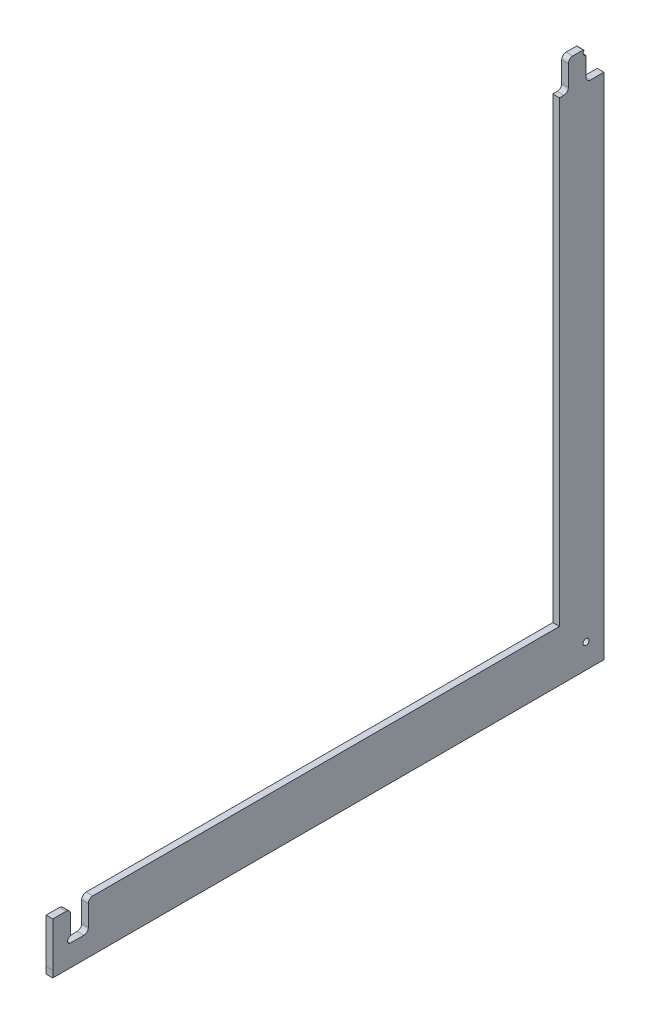
ISO-10303-21;
HEADER;
FILE_DESCRIPTION(('STEP AP214'),'2;1');
FILE_NAME('part.step','',(''),(''),'','','');
FILE_SCHEMA(('AUTOMOTIVE_DESIGN { 1 0 10303 214 1 1 1 1 }'));
ENDSEC;
DATA;
#1=APPLICATION_CONTEXT('core data for automotive mechanical design processes');
#2=APPLICATION_PROTOCOL_DEFINITION('international standard','automotive_design',2000,#1);
#3=PRODUCT_CONTEXT('',#1,'mechanical');
#4=PRODUCT('Part','Part','',(#3));
#5=PRODUCT_RELATED_PRODUCT_CATEGORY('part','',(#4));
#6=PRODUCT_DEFINITION_FORMATION('','',#4);
#7=PRODUCT_DEFINITION_CONTEXT('part definition',#1,'design');
#8=PRODUCT_DEFINITION('design','',#6,#7);
#9=PRODUCT_DEFINITION_SHAPE('','',#8);
#10=(LENGTH_UNIT() NAMED_UNIT(*) SI_UNIT(.MILLI.,.METRE.));
#11=(NAMED_UNIT(*) PLANE_ANGLE_UNIT() SI_UNIT($,.RADIAN.));
#12=(NAMED_UNIT(*) SI_UNIT($,.STERADIAN.) SOLID_ANGLE_UNIT());
#13=UNCERTAINTY_MEASURE_WITH_UNIT(LENGTH_MEASURE(1.E-05),#10,'distance_accuracy_value','');
#14=(GEOMETRIC_REPRESENTATION_CONTEXT(3) GLOBAL_UNCERTAINTY_ASSIGNED_CONTEXT((#13)) GLOBAL_UNIT_ASSIGNED_CONTEXT((#10,
#11,#12)) REPRESENTATION_CONTEXT('',''));
#15=CARTESIAN_POINT('',(0.,0.,0.));
#16=DIRECTION('',(0.,0.,1.));
#17=DIRECTION('',(1.,0.,0.));
#18=AXIS2_PLACEMENT_3D('',#15,#16,#17);
#19=CARTESIAN_POINT('',(4.5,0.,12.));
#20=DIRECTION('',(0.,0.,-1.));
#21=DIRECTION('',(0.,1.,0.));
#22=AXIS2_PLACEMENT_3D('',#19,#20,#21);
#23=PLANE('',#22);
#24=DIRECTION('',(0.,-1.,0.));
#25=VECTOR('',#24,1.);
#26=CARTESIAN_POINT('',(4.5,0.,12.));
#27=LINE('',#26,#25);
#28=CARTESIAN_POINT('',(4.5,354.550510257195,12.0000000000001));
#29=VERTEX_POINT('',#28);
#30=CARTESIAN_POINT('',(4.5,342.,12.0000000000001));
#31=VERTEX_POINT('',#30);
#32=EDGE_CURVE('E483',#29,#31,#27,.T.);
#33=ORIENTED_EDGE('',*,*,#32,.T.);
#34=DIRECTION('',(-1.,0.,0.));
#35=VECTOR('',#34,1.);
#36=CARTESIAN_POINT('',(0.,342.,12.0000000000001));
#37=LINE('',#36,#35);
#38=CARTESIAN_POINT('',(0.,342.,12.0000000000001));
#39=VERTEX_POINT('',#38);
#40=EDGE_CURVE('E354',#31,#39,#37,.T.);
#41=ORIENTED_EDGE('',*,*,#40,.T.);
#42=DIRECTION('',(0.,-1.,0.));
#43=VECTOR('',#42,1.);
#44=CARTESIAN_POINT('',(0.,0.,12.));
#45=LINE('',#44,#43);
#46=CARTESIAN_POINT('',(0.,354.550510257195,12.0000000000001));
#47=VERTEX_POINT('',#46);
#48=EDGE_CURVE('E266',#47,#39,#45,.T.);
#49=ORIENTED_EDGE('',*,*,#48,.F.);
#50=DIRECTION('',(-1.,0.,0.));
#51=VECTOR('',#50,1.);
#52=CARTESIAN_POINT('',(4.5,354.550510257195,12.0000000000001));
#53=LINE('',#52,#51);
#54=EDGE_CURVE('E321',#47,#29,#53,.F.);
#55=ORIENTED_EDGE('',*,*,#54,.T.);
#56=EDGE_LOOP('',(#33,#41,#49,#55));
#57=FACE_BOUND('',#56,.T.);
#58=ADVANCED_FACE('F39',(#57),#23,.T.);
#59=CARTESIAN_POINT('',(4.5,0.,360.));
#60=DIRECTION('',(0.,0.,-1.));
#61=DIRECTION('',(-1.,0.,0.));
#62=AXIS2_PLACEMENT_3D('',#59,#60,#61);
#63=PLANE('',#62);
#64=DIRECTION('',(0.,-1.,0.));
#65=VECTOR('',#64,1.);
#66=CARTESIAN_POINT('',(0.,0.,360.));
#67=LINE('',#66,#65);
#68=CARTESIAN_POINT('',(0.,27.,360.));
#69=VERTEX_POINT('',#68);
#70=CARTESIAN_POINT('',(0.,14.4494897427716,360.));
#71=VERTEX_POINT('',#70);
#72=EDGE_CURVE('E285',#69,#71,#67,.T.);
#73=ORIENTED_EDGE('',*,*,#72,.F.);
#74=DIRECTION('',(-1.,0.,0.));
#75=VECTOR('',#74,1.);
#76=CARTESIAN_POINT('',(4.5,27.,360.));
#77=LINE('',#76,#75);
#78=CARTESIAN_POINT('',(4.5,27.,360.));
#79=VERTEX_POINT('',#78);
#80=EDGE_CURVE('E376',#69,#79,#77,.F.);
#81=ORIENTED_EDGE('',*,*,#80,.T.);
#82=DIRECTION('',(0.,-1.,0.));
#83=VECTOR('',#82,1.);
#84=CARTESIAN_POINT('',(4.5,0.,360.));
#85=LINE('',#84,#83);
#86=CARTESIAN_POINT('',(4.5,14.4494897427716,360.));
#87=VERTEX_POINT('',#86);
#88=EDGE_CURVE('E240',#79,#87,#85,.T.);
#89=ORIENTED_EDGE('',*,*,#88,.T.);
#90=DIRECTION('',(-1.,0.,0.));
#91=VECTOR('',#90,1.);
#92=CARTESIAN_POINT('',(4.5,14.4494897427716,360.));
#93=LINE('',#92,#91);
#94=EDGE_CURVE('E341',#87,#71,#93,.T.);
#95=ORIENTED_EDGE('',*,*,#94,.T.);
#96=EDGE_LOOP('',(#73,#81,#89,#95));
#97=FACE_BOUND('',#96,.T.);
#98=ADVANCED_FACE('F417',(#97),#63,.T.);
#99=CARTESIAN_POINT('',(4.5,339.,0.));
#100=DIRECTION('',(0.,1.,0.));
#101=DIRECTION('',(0.,0.,1.));
#102=AXIS2_PLACEMENT_3D('',#99,#100,#101);
#103=PLANE('',#102);
#104=DIRECTION('',(0.,0.,-1.));
#105=VECTOR('',#104,1.);
#106=CARTESIAN_POINT('',(0.,339.,0.));
#107=LINE('',#106,#105);
#108=CARTESIAN_POINT('',(0.,339.,9.00000000000006));
#109=VERTEX_POINT('',#108);
#110=CARTESIAN_POINT('',(0.,339.,0.));
#111=VERTEX_POINT('',#110);
#112=EDGE_CURVE('E264',#109,#111,#107,.T.);
#113=ORIENTED_EDGE('',*,*,#112,.F.);
#114=DIRECTION('',(-1.,0.,0.));
#115=VECTOR('',#114,1.);
#116=CARTESIAN_POINT('',(4.5,339.,9.00000000000006));
#117=LINE('',#116,#115);
#118=CARTESIAN_POINT('',(4.5,339.,9.00000000000006));
#119=VERTEX_POINT('',#118);
#120=EDGE_CURVE('E357',#109,#119,#117,.F.);
#121=ORIENTED_EDGE('',*,*,#120,.T.);
#122=DIRECTION('',(0.,0.,-1.));
#123=VECTOR('',#122,1.);
#124=CARTESIAN_POINT('',(4.5,339.,0.));
#125=LINE('',#124,#123);
#126=CARTESIAN_POINT('',(4.5,339.,0.));
#127=VERTEX_POINT('',#126);
#128=EDGE_CURVE('E485',#119,#127,#125,.T.);
#129=ORIENTED_EDGE('',*,*,#128,.T.);
#130=DIRECTION('',(-1.,0.,0.));
#131=VECTOR('',#130,1.);
#132=CARTESIAN_POINT('',(4.5,339.,0.));
#133=LINE('',#132,#131);
#134=EDGE_CURVE('E261',#127,#111,#133,.T.);
#135=ORIENTED_EDGE('',*,*,#134,.T.);
#136=EDGE_LOOP('',(#113,#121,#129,#135));
#137=FACE_BOUND('',#136,.T.);
#138=ADVANCED_FACE('F423',(#137),#103,.T.);
#139=CARTESIAN_POINT('',(4.5,359.,0.));
#140=DIRECTION('',(0.,1.,0.));
#141=DIRECTION('',(0.,0.,1.));
#142=AXIS2_PLACEMENT_3D('',#139,#140,#141);
#143=PLANE('',#142);
#144=DIRECTION('',(0.,0.,-1.));
#145=VECTOR('',#144,1.);
#146=CARTESIAN_POINT('',(0.,359.,0.));
#147=LINE('',#146,#145);
#148=CARTESIAN_POINT('',(0.,359.,21.));
#149=VERTEX_POINT('',#148);
#150=CARTESIAN_POINT('',(0.,359.,13.9999999999501));
#151=VERTEX_POINT('',#150);
#152=EDGE_CURVE('E269',#149,#151,#147,.T.);
#153=ORIENTED_EDGE('',*,*,#152,.F.);
#154=DIRECTION('',(-1.,0.,0.));
#155=VECTOR('',#154,1.);
#156=CARTESIAN_POINT('',(4.5,359.,21.));
#157=LINE('',#156,#155);
#158=CARTESIAN_POINT('',(4.5,359.,21.));
#159=VERTEX_POINT('',#158);
#160=EDGE_CURVE('E54',#149,#159,#157,.F.);
#161=ORIENTED_EDGE('',*,*,#160,.T.);
#162=DIRECTION('',(0.,0.,-1.));
#163=VECTOR('',#162,1.);
#164=CARTESIAN_POINT('',(4.5,359.,0.));
#165=LINE('',#164,#163);
#166=CARTESIAN_POINT('',(4.5,359.,13.9999999999501));
#167=VERTEX_POINT('',#166);
#168=EDGE_CURVE('E481',#159,#167,#165,.T.);
#169=ORIENTED_EDGE('',*,*,#168,.T.);
#170=DIRECTION('',(-1.,0.,0.));
#171=VECTOR('',#170,1.);
#172=CARTESIAN_POINT('',(4.5,359.,13.9999999999501));
#173=LINE('',#172,#171);
#174=EDGE_CURVE('E331',#167,#151,#173,.T.);
#175=ORIENTED_EDGE('',*,*,#174,.T.);
#176=EDGE_LOOP('',(#153,#161,#169,#175));
#177=FACE_BOUND('',#176,.T.);
#178=ADVANCED_FACE('F429',(#177),#143,.T.);
#179=CARTESIAN_POINT('',(4.5,0.,24.));
#180=DIRECTION('',(0.,0.,1.));
#181=DIRECTION('',(0.,-1.,0.));
#182=AXIS2_PLACEMENT_3D('',#179,#180,#181);
#183=PLANE('',#182);
#184=DIRECTION('',(0.,1.,0.));
#185=VECTOR('',#184,1.);
#186=CARTESIAN_POINT('',(4.5,0.,24.));
#187=LINE('',#186,#185);
#188=CARTESIAN_POINT('',(4.5,342.,24.));
#189=VERTEX_POINT('',#188);
#190=CARTESIAN_POINT('',(4.5,356.,24.));
#191=VERTEX_POINT('',#190);
#192=EDGE_CURVE('E478',#189,#191,#187,.T.);
#193=ORIENTED_EDGE('',*,*,#192,.T.);
#194=DIRECTION('',(-1.,0.,0.));
#195=VECTOR('',#194,1.);
#196=CARTESIAN_POINT('',(4.5,356.,24.));
#197=LINE('',#196,#195);
#198=CARTESIAN_POINT('',(0.,356.,24.));
#199=VERTEX_POINT('',#198);
#200=EDGE_CURVE('E390',#191,#199,#197,.T.);
#201=ORIENTED_EDGE('',*,*,#200,.T.);
#202=DIRECTION('',(0.,1.,0.));
#203=VECTOR('',#202,1.);
#204=CARTESIAN_POINT('',(0.,0.,24.));
#205=LINE('',#204,#203);
#206=CARTESIAN_POINT('',(0.,342.,24.));
#207=VERTEX_POINT('',#206);
#208=EDGE_CURVE('E271',#207,#199,#205,.T.);
#209=ORIENTED_EDGE('',*,*,#208,.F.);
#210=DIRECTION('',(-1.,0.,0.));
#211=VECTOR('',#210,1.);
#212=CARTESIAN_POINT('',(4.5,342.,24.));
#213=LINE('',#212,#211);
#214=EDGE_CURVE('E352',#207,#189,#213,.F.);
#215=ORIENTED_EDGE('',*,*,#214,.T.);
#216=EDGE_LOOP('',(#193,#201,#209,#215));
#217=FACE_BOUND('',#216,.T.);
#218=ADVANCED_FACE('F553',(#217),#183,.T.);
#219=CARTESIAN_POINT('',(4.5,339.,0.));
#220=DIRECTION('',(0.,1.,0.));
#221=DIRECTION('',(0.,0.,1.));
#222=AXIS2_PLACEMENT_3D('',#219,#220,#221);
#223=PLANE('',#222);
#224=DIRECTION('',(0.,0.,-1.));
#225=VECTOR('',#224,1.);
#226=CARTESIAN_POINT('',(4.5,339.,0.));
#227=LINE('',#226,#225);
#228=CARTESIAN_POINT('',(4.5,339.,30.));
#229=VERTEX_POINT('',#228);
#230=CARTESIAN_POINT('',(4.5,339.,27.));
#231=VERTEX_POINT('',#230);
#232=EDGE_CURVE('E473',#229,#231,#227,.T.);
#233=ORIENTED_EDGE('',*,*,#232,.T.);
#234=DIRECTION('',(-1.,0.,0.));
#235=VECTOR('',#234,1.);
#236=CARTESIAN_POINT('',(0.,339.,27.));
#237=LINE('',#236,#235);
#238=CARTESIAN_POINT('',(0.,339.,27.));
#239=VERTEX_POINT('',#238);
#240=EDGE_CURVE('E349',#231,#239,#237,.T.);
#241=ORIENTED_EDGE('',*,*,#240,.T.);
#242=DIRECTION('',(0.,0.,-1.));
#243=VECTOR('',#242,1.);
#244=CARTESIAN_POINT('',(0.,339.,0.));
#245=LINE('',#244,#243);
#246=CARTESIAN_POINT('',(0.,339.,30.));
#247=VERTEX_POINT('',#246);
#248=EDGE_CURVE('E273',#247,#239,#245,.T.);
#249=ORIENTED_EDGE('',*,*,#248,.F.);
#250=DIRECTION('',(-1.,0.,0.));
#251=VECTOR('',#250,1.);
#252=CARTESIAN_POINT('',(4.5,339.,30.));
#253=LINE('',#252,#251);
#254=EDGE_CURVE('E314',#229,#247,#253,.T.);
#255=ORIENTED_EDGE('',*,*,#254,.F.);
#256=EDGE_LOOP('',(#233,#241,#249,#255));
#257=FACE_BOUND('',#256,.T.);
#258=ADVANCED_FACE('F550',(#257),#223,.T.);
#259=CARTESIAN_POINT('',(4.5,0.,30.));
#260=DIRECTION('',(0.,0.,1.));
#261=DIRECTION('',(0.,-1.,0.));
#262=AXIS2_PLACEMENT_3D('',#259,#260,#261);
#263=PLANE('',#262);
#264=DIRECTION('',(0.,1.,0.));
#265=VECTOR('',#264,1.);
#266=CARTESIAN_POINT('',(0.,0.,30.));
#267=LINE('',#266,#265);
#268=CARTESIAN_POINT('',(0.,30.,30.));
#269=VERTEX_POINT('',#268);
#270=EDGE_CURVE('E276',#269,#247,#267,.T.);
#271=ORIENTED_EDGE('',*,*,#270,.F.);
#272=DIRECTION('',(-1.,0.,0.));
#273=VECTOR('',#272,1.);
#274=CARTESIAN_POINT('',(4.5,30.,30.));
#275=LINE('',#274,#273);
#276=CARTESIAN_POINT('',(4.5,30.,30.));
#277=VERTEX_POINT('',#276);
#278=EDGE_CURVE('E234',#277,#269,#275,.T.);
#279=ORIENTED_EDGE('',*,*,#278,.F.);
#280=DIRECTION('',(0.,1.,0.));
#281=VECTOR('',#280,1.);
#282=CARTESIAN_POINT('',(4.5,0.,30.));
#283=LINE('',#282,#281);
#284=EDGE_CURVE('E471',#277,#229,#283,.T.);
#285=ORIENTED_EDGE('',*,*,#284,.T.);
#286=ORIENTED_EDGE('',*,*,#254,.T.);
#287=EDGE_LOOP('',(#271,#279,#285,#286));
#288=FACE_BOUND('',#287,.T.);
#289=ADVANCED_FACE('F547',(#288),#263,.T.);
#290=CARTESIAN_POINT('',(4.5,30.,0.));
#291=DIRECTION('',(0.,-1.,0.));
#292=DIRECTION('',(0.,0.,-1.));
#293=AXIS2_PLACEMENT_3D('',#290,#291,#292);
#294=PLANE('',#293);
#295=DIRECTION('',(0.,0.,1.));
#296=VECTOR('',#295,1.);
#297=CARTESIAN_POINT('',(0.,30.,0.));
#298=LINE('',#297,#296);
#299=CARTESIAN_POINT('',(0.,30.,345.));
#300=VERTEX_POINT('',#299);
#301=EDGE_CURVE('E279',#269,#300,#298,.T.);
#302=ORIENTED_EDGE('',*,*,#301,.T.);
#303=DIRECTION('',(-1.,0.,0.));
#304=VECTOR('',#303,1.);
#305=CARTESIAN_POINT('',(4.5,30.,345.));
#306=LINE('',#305,#304);
#307=CARTESIAN_POINT('',(4.5,30.,345.));
#308=VERTEX_POINT('',#307);
#309=EDGE_CURVE('E366',#300,#308,#306,.F.);
#310=ORIENTED_EDGE('',*,*,#309,.T.);
#311=DIRECTION('',(0.,0.,1.));
#312=VECTOR('',#311,1.);
#313=CARTESIAN_POINT('',(4.5,30.,0.));
#314=LINE('',#313,#312);
#315=EDGE_CURVE('E245',#277,#308,#314,.T.);
#316=ORIENTED_EDGE('',*,*,#315,.F.);
#317=ORIENTED_EDGE('',*,*,#278,.T.);
#318=EDGE_LOOP('',(#302,#310,#316,#317));
#319=FACE_BOUND('',#318,.T.);
#320=ADVANCED_FACE('F544',(#319),#294,.F.);
#321=CARTESIAN_POINT('',(4.5,0.,348.));
#322=DIRECTION('',(0.,0.,1.));
#323=DIRECTION('',(1.,0.,0.));
#324=AXIS2_PLACEMENT_3D('',#321,#322,#323);
#325=PLANE('',#324);
#326=DIRECTION('',(0.,1.,0.));
#327=VECTOR('',#326,1.);
#328=CARTESIAN_POINT('',(0.,0.,348.));
#329=LINE('',#328,#327);
#330=CARTESIAN_POINT('',(0.,13.,348.));
#331=VERTEX_POINT('',#330);
#332=CARTESIAN_POINT('',(0.,27.,348.));
#333=VERTEX_POINT('',#332);
#334=EDGE_CURVE('E282',#331,#333,#329,.T.);
#335=ORIENTED_EDGE('',*,*,#334,.F.);
#336=DIRECTION('',(-1.,0.,0.));
#337=VECTOR('',#336,1.);
#338=CARTESIAN_POINT('',(4.5,13.,348.));
#339=LINE('',#338,#337);
#340=CARTESIAN_POINT('',(4.5,13.,348.));
#341=VERTEX_POINT('',#340);
#342=EDGE_CURVE('E388',#331,#341,#339,.F.);
#343=ORIENTED_EDGE('',*,*,#342,.T.);
#344=DIRECTION('',(0.,1.,0.));
#345=VECTOR('',#344,1.);
#346=CARTESIAN_POINT('',(4.5,0.,348.));
#347=LINE('',#346,#345);
#348=CARTESIAN_POINT('',(4.5,27.,348.));
#349=VERTEX_POINT('',#348);
#350=EDGE_CURVE('E241',#341,#349,#347,.T.);
#351=ORIENTED_EDGE('',*,*,#350,.T.);
#352=DIRECTION('',(-1.,0.,0.));
#353=VECTOR('',#352,1.);
#354=CARTESIAN_POINT('',(0.,27.,348.));
#355=LINE('',#354,#353);
#356=EDGE_CURVE('E359',#349,#333,#355,.T.);
#357=ORIENTED_EDGE('',*,*,#356,.T.);
#358=EDGE_LOOP('',(#335,#343,#351,#357));
#359=FACE_BOUND('',#358,.T.);
#360=ADVANCED_FACE('F403',(#359),#325,.T.);
#361=CARTESIAN_POINT('',(4.5,9.99999999999999,0.));
#362=DIRECTION('',(0.,1.,0.));
#363=DIRECTION('',(0.,0.,1.));
#364=AXIS2_PLACEMENT_3D('',#361,#362,#363);
#365=PLANE('',#364);
#366=DIRECTION('',(0.,0.,-1.));
#367=VECTOR('',#366,1.);
#368=CARTESIAN_POINT('',(4.5,9.99999999999999,0.));
#369=LINE('',#368,#367);
#370=CARTESIAN_POINT('',(4.5,9.99999999999979,359.999999999945));
#371=VERTEX_POINT('',#370);
#372=CARTESIAN_POINT('',(4.5,9.99999999999999,351.));
#373=VERTEX_POINT('',#372);
#374=EDGE_CURVE('E230',#371,#373,#369,.T.);
#375=ORIENTED_EDGE('',*,*,#374,.T.);
#376=DIRECTION('',(-1.,0.,0.));
#377=VECTOR('',#376,1.);
#378=CARTESIAN_POINT('',(0.,9.99999999999999,351.));
#379=LINE('',#378,#377);
#380=CARTESIAN_POINT('',(0.,9.99999999999999,351.));
#381=VERTEX_POINT('',#380);
#382=EDGE_CURVE('E386',#373,#381,#379,.T.);
#383=ORIENTED_EDGE('',*,*,#382,.T.);
#384=DIRECTION('',(0.,0.,-1.));
#385=VECTOR('',#384,1.);
#386=CARTESIAN_POINT('',(0.,9.99999999999999,0.));
#387=LINE('',#386,#385);
#388=CARTESIAN_POINT('',(0.,9.99999999999999,360.));
#389=VERTEX_POINT('',#388);
#390=EDGE_CURVE('E233',#389,#381,#387,.T.);
#391=ORIENTED_EDGE('',*,*,#390,.F.);
#392=DIRECTION('',(-1.,0.,0.));
#393=VECTOR('',#392,1.);
#394=CARTESIAN_POINT('',(4.5,9.99999999999999,360.));
#395=LINE('',#394,#393);
#396=EDGE_CURVE('E214',#371,#389,#395,.T.);
#397=ORIENTED_EDGE('',*,*,#396,.F.);
#398=EDGE_LOOP('',(#375,#383,#391,#397));
#399=FACE_BOUND('',#398,.T.);
#400=ADVANCED_FACE('F228',(#399),#365,.T.);
#401=CARTESIAN_POINT('',(4.5,30.0000000000001,0.));
#402=DIRECTION('',(0.,-1.,0.));
#403=DIRECTION('',(0.,0.,-1.));
#404=AXIS2_PLACEMENT_3D('',#401,#402,#403);
#405=PLANE('',#404);
#406=DIRECTION('',(0.,0.,1.));
#407=VECTOR('',#406,1.);
#408=CARTESIAN_POINT('',(4.5,30.0000000000001,0.));
#409=LINE('',#408,#407);
#410=CARTESIAN_POINT('',(4.5,30.,363.));
#411=VERTEX_POINT('',#410);
#412=CARTESIAN_POINT('',(4.5,30.,372.));
#413=VERTEX_POINT('',#412);
#414=EDGE_CURVE('E243',#411,#413,#409,.T.);
#415=ORIENTED_EDGE('',*,*,#414,.F.);
#416=DIRECTION('',(-1.,0.,0.));
#417=VECTOR('',#416,1.);
#418=CARTESIAN_POINT('',(0.,30.,363.));
#419=LINE('',#418,#417);
#420=CARTESIAN_POINT('',(0.,30.,363.));
#421=VERTEX_POINT('',#420);
#422=EDGE_CURVE('E373',#411,#421,#419,.T.);
#423=ORIENTED_EDGE('',*,*,#422,.T.);
#424=DIRECTION('',(0.,0.,1.));
#425=VECTOR('',#424,1.);
#426=CARTESIAN_POINT('',(0.,30.0000000000001,0.));
#427=LINE('',#426,#425);
#428=CARTESIAN_POINT('',(0.,30.,372.));
#429=VERTEX_POINT('',#428);
#430=EDGE_CURVE('E287',#421,#429,#427,.T.);
#431=ORIENTED_EDGE('',*,*,#430,.T.);
#432=DIRECTION('',(-1.,0.,0.));
#433=VECTOR('',#432,1.);
#434=CARTESIAN_POINT('',(4.5,30.,372.));
#435=LINE('',#434,#433);
#436=EDGE_CURVE('E235',#413,#429,#435,.T.);
#437=ORIENTED_EDGE('',*,*,#436,.F.);
#438=EDGE_LOOP('',(#415,#423,#431,#437));
#439=FACE_BOUND('',#438,.T.);
#440=ADVANCED_FACE('F525',(#439),#405,.F.);
#441=CARTESIAN_POINT('',(4.5,0.,372.));
#442=DIRECTION('',(0.,0.,1.));
#443=DIRECTION('',(1.,0.,0.));
#444=AXIS2_PLACEMENT_3D('',#441,#442,#443);
#445=PLANE('',#444);
#446=DIRECTION('',(0.,1.,0.));
#447=VECTOR('',#446,1.);
#448=CARTESIAN_POINT('',(0.,0.,372.));
#449=LINE('',#448,#447);
#450=CARTESIAN_POINT('',(0.,0.,372.));
#451=VERTEX_POINT('',#450);
#452=EDGE_CURVE('E289',#451,#429,#449,.T.);
#453=ORIENTED_EDGE('',*,*,#452,.F.);
#454=DIRECTION('',(-1.,0.,0.));
#455=VECTOR('',#454,1.);
#456=CARTESIAN_POINT('',(4.5,0.,372.));
#457=LINE('',#456,#455);
#458=CARTESIAN_POINT('',(4.5,0.,372.));
#459=VERTEX_POINT('',#458);
#460=EDGE_CURVE('E309',#459,#451,#457,.T.);
#461=ORIENTED_EDGE('',*,*,#460,.F.);
#462=DIRECTION('',(0.,1.,0.));
#463=VECTOR('',#462,1.);
#464=CARTESIAN_POINT('',(4.5,0.,372.));
#465=LINE('',#464,#463);
#466=EDGE_CURVE('E250',#459,#413,#465,.T.);
#467=ORIENTED_EDGE('',*,*,#466,.T.);
#468=ORIENTED_EDGE('',*,*,#436,.T.);
#469=EDGE_LOOP('',(#453,#461,#467,#468));
#470=FACE_BOUND('',#469,.T.);
#471=ADVANCED_FACE('F519',(#470),#445,.T.);
#472=CARTESIAN_POINT('',(4.5,0.000160018972517681,371.999999999931));
#473=DIRECTION('',(0.,-4.30158528273375E-07,-0.999999999999908));
#474=DIRECTION('',(0.,0.999999999999908,-4.30158528273375E-07));
#475=AXIS2_PLACEMENT_3D('',#472,#473,#474);
#476=PLANE('',#475);
#477=DIRECTION('',(0.,-0.999999999999908,4.30158528273375E-07));
#478=VECTOR('',#477,1.);
#479=CARTESIAN_POINT('',(0.,0.000160018972517681,371.999999999931));
#480=LINE('',#479,#478);
#481=CARTESIAN_POINT('',(0.,-4.49995893978229,372.000001935696));
#482=VERTEX_POINT('',#481);
#483=EDGE_CURVE('E292',#451,#482,#480,.T.);
#484=ORIENTED_EDGE('',*,*,#483,.T.);
#485=DIRECTION('',(-1.,0.,0.));
#486=VECTOR('',#485,1.);
#487=CARTESIAN_POINT('',(4.5,-4.49995893978229,372.000001935696));
#488=LINE('',#487,#486);
#489=CARTESIAN_POINT('',(4.5,-4.49995893978229,372.000001935696));
#490=VERTEX_POINT('',#489);
#491=EDGE_CURVE('E306',#490,#482,#488,.T.);
#492=ORIENTED_EDGE('',*,*,#491,.F.);
#493=DIRECTION('',(0.,-0.999999999999908,4.30158528273375E-07));
#494=VECTOR('',#493,1.);
#495=CARTESIAN_POINT('',(4.5,0.000160018972517681,371.999999999931));
#496=LINE('',#495,#494);
#497=EDGE_CURVE('E253',#459,#490,#496,.T.);
#498=ORIENTED_EDGE('',*,*,#497,.F.);
#499=ORIENTED_EDGE('',*,*,#460,.T.);
#500=EDGE_LOOP('',(#484,#492,#498,#499));
#501=FACE_BOUND('',#500,.T.);
#502=ADVANCED_FACE('F516',(#501),#476,.F.);
#503=CARTESIAN_POINT('',(4.5,-4.50000258092798,5.27917385794753E-07));
#504=DIRECTION('',(0.,0.999999999999993,-1.17314907336316E-07));
#505=DIRECTION('',(0.,1.17314907336316E-07,0.999999999999993));
#506=AXIS2_PLACEMENT_3D('',#503,#504,#505);
#507=PLANE('',#506);
#508=DIRECTION('',(0.,-1.17314907336316E-07,-0.999999999999993));
#509=VECTOR('',#508,1.);
#510=CARTESIAN_POINT('',(0.,-4.50000258092798,5.27917385794753E-07));
#511=LINE('',#510,#509);
#512=CARTESIAN_POINT('',(0.,-4.50000258092804,0.));
#513=VERTEX_POINT('',#512);
#514=EDGE_CURVE('E295',#482,#513,#511,.T.);
#515=ORIENTED_EDGE('',*,*,#514,.T.);
#516=DIRECTION('',(-1.,0.,0.));
#517=VECTOR('',#516,1.);
#518=CARTESIAN_POINT('',(4.5,-4.50000258092804,0.));
#519=LINE('',#518,#517);
#520=CARTESIAN_POINT('',(4.5,-4.50000258092804,0.));
#521=VERTEX_POINT('',#520);
#522=EDGE_CURVE('E304',#521,#513,#519,.T.);
#523=ORIENTED_EDGE('',*,*,#522,.F.);
#524=DIRECTION('',(0.,-1.17314907336316E-07,-0.999999999999993));
#525=VECTOR('',#524,1.);
#526=CARTESIAN_POINT('',(4.5,-4.50000258092798,5.27917385794753E-07));
#527=LINE('',#526,#525);
#528=EDGE_CURVE('E256',#490,#521,#527,.T.);
#529=ORIENTED_EDGE('',*,*,#528,.F.);
#530=ORIENTED_EDGE('',*,*,#491,.T.);
#531=EDGE_LOOP('',(#515,#523,#529,#530));
#532=FACE_BOUND('',#531,.T.);
#533=ADVANCED_FACE('F438',(#532),#507,.F.);
#534=CARTESIAN_POINT('',(4.5,12.,12.));
#535=DIRECTION('',(-1.,0.,0.));
#536=DIRECTION('',(0.,0.,1.));
#537=AXIS2_PLACEMENT_3D('',#534,#535,#536);
#538=CYLINDRICAL_SURFACE('',#537,2.);
#539=CARTESIAN_POINT('',(4.5,12.,12.));
#540=DIRECTION('',(1.,0.,0.));
#541=DIRECTION('',(0.,0.,-1.));
#542=AXIS2_PLACEMENT_3D('',#539,#540,#541);
#543=CIRCLE('',#542,2.);
#544=CARTESIAN_POINT('',(4.5,12.,9.99999999999997));
#545=VERTEX_POINT('',#544);
#546=EDGE_CURVE('E301',#545,#545,#543,.T.);
#547=ORIENTED_EDGE('',*,*,#546,.T.);
#548=EDGE_LOOP('',(#547));
#549=FACE_BOUND('',#548,.T.);
#550=CARTESIAN_POINT('',(0.,12.,12.));
#551=DIRECTION('',(1.,0.,0.));
#552=DIRECTION('',(0.,0.,-1.));
#553=AXIS2_PLACEMENT_3D('',#550,#551,#552);
#554=CIRCLE('',#553,2.);
#555=CARTESIAN_POINT('',(0.,12.,9.99999999999997));
#556=VERTEX_POINT('',#555);
#557=EDGE_CURVE('E222',#556,#556,#554,.T.);
#558=ORIENTED_EDGE('',*,*,#557,.F.);
#559=EDGE_LOOP('',(#558));
#560=FACE_BOUND('',#559,.T.);
#561=ADVANCED_FACE('F434',(#549,#560),#538,.F.);
#562=CARTESIAN_POINT('',(4.5,0.,0.));
#563=DIRECTION('',(0.,0.,-1.));
#564=DIRECTION('',(-1.,0.,0.));
#565=AXIS2_PLACEMENT_3D('',#562,#563,#564);
#566=PLANE('',#565);
#567=DIRECTION('',(0.,-1.,0.));
#568=VECTOR('',#567,1.);
#569=CARTESIAN_POINT('',(0.,0.,0.));
#570=LINE('',#569,#568);
#571=EDGE_CURVE('E298',#111,#513,#570,.T.);
#572=ORIENTED_EDGE('',*,*,#571,.F.);
#573=ORIENTED_EDGE('',*,*,#134,.F.);
#574=DIRECTION('',(0.,-1.,0.));
#575=VECTOR('',#574,1.);
#576=CARTESIAN_POINT('',(4.5,0.,0.));
#577=LINE('',#576,#575);
#578=EDGE_CURVE('E258',#127,#521,#577,.T.);
#579=ORIENTED_EDGE('',*,*,#578,.T.);
#580=ORIENTED_EDGE('',*,*,#522,.T.);
#581=EDGE_LOOP('',(#572,#573,#579,#580));
#582=FACE_BOUND('',#581,.T.);
#583=ADVANCED_FACE('F437',(#582),#566,.T.);
#584=CARTESIAN_POINT('',(4.5,0.,0.));
#585=DIRECTION('',(1.,0.,0.));
#586=DIRECTION('',(0.,0.,-1.));
#587=AXIS2_PLACEMENT_3D('',#584,#585,#586);
#588=PLANE('',#587);
#589=ORIENTED_EDGE('',*,*,#546,.F.);
#590=EDGE_LOOP('',(#589));
#591=FACE_BOUND('',#590,.T.);
#592=ORIENTED_EDGE('',*,*,#168,.F.);
#593=CARTESIAN_POINT('',(4.5,356.,21.));
#594=DIRECTION('',(1.,0.,0.));
#595=DIRECTION('',(0.,0.,-1.));
#596=AXIS2_PLACEMENT_3D('',#593,#594,#595);
#597=CIRCLE('',#596,3.);
#598=EDGE_CURVE('E395',#159,#191,#597,.T.);
#599=ORIENTED_EDGE('',*,*,#598,.T.);
#600=ORIENTED_EDGE('',*,*,#192,.F.);
#601=CARTESIAN_POINT('',(4.5,342.,27.));
#602=DIRECTION('',(1.,0.,0.));
#603=DIRECTION('',(0.,0.,-1.));
#604=AXIS2_PLACEMENT_3D('',#601,#602,#603);
#605=CIRCLE('',#604,3.);
#606=EDGE_CURVE('E380',#189,#231,#605,.F.);
#607=ORIENTED_EDGE('',*,*,#606,.T.);
#608=ORIENTED_EDGE('',*,*,#232,.F.);
#609=ORIENTED_EDGE('',*,*,#284,.F.);
#610=ORIENTED_EDGE('',*,*,#315,.T.);
#611=CARTESIAN_POINT('',(4.5,27.,345.));
#612=DIRECTION('',(1.,0.,0.));
#613=DIRECTION('',(0.,0.,-1.));
#614=AXIS2_PLACEMENT_3D('',#611,#612,#613);
#615=CIRCLE('',#614,3.);
#616=EDGE_CURVE('E370',#308,#349,#615,.T.);
#617=ORIENTED_EDGE('',*,*,#616,.T.);
#618=ORIENTED_EDGE('',*,*,#350,.F.);
#619=CARTESIAN_POINT('',(4.5,13.,351.));
#620=DIRECTION('',(1.,0.,0.));
#621=DIRECTION('',(0.,0.,-1.));
#622=AXIS2_PLACEMENT_3D('',#619,#620,#621);
#623=CIRCLE('',#622,3.);
#624=EDGE_CURVE('E11',#341,#373,#623,.F.);
#625=ORIENTED_EDGE('',*,*,#624,.T.);
#626=ORIENTED_EDGE('',*,*,#374,.F.);
#627=CARTESIAN_POINT('',(4.5,11.9999999999997,359.999999999945));
#628=DIRECTION('',(-1.,0.,0.));
#629=DIRECTION('',(0.,0.,1.));
#630=AXIS2_PLACEMENT_3D('',#627,#628,#629);
#631=CIRCLE('',#630,1.99999999999994);
#632=CARTESIAN_POINT('',(4.5,13.9595917942172,360.399999999989));
#633=VERTEX_POINT('',#632);
#634=EDGE_CURVE('E210',#633,#371,#631,.F.);
#635=ORIENTED_EDGE('',*,*,#634,.F.);
#636=CARTESIAN_POINT('',(4.5,14.4494897427716,360.5));
#637=DIRECTION('',(1.,0.,0.));
#638=DIRECTION('',(0.,0.,-1.));
#639=AXIS2_PLACEMENT_3D('',#636,#637,#638);
#640=CIRCLE('',#639,0.5);
#641=EDGE_CURVE('E347',#633,#87,#640,.T.);
#642=ORIENTED_EDGE('',*,*,#641,.T.);
#643=ORIENTED_EDGE('',*,*,#88,.F.);
#644=CARTESIAN_POINT('',(4.5,27.,363.));
#645=DIRECTION('',(1.,0.,0.));
#646=DIRECTION('',(0.,0.,-1.));
#647=AXIS2_PLACEMENT_3D('',#644,#645,#646);
#648=CIRCLE('',#647,3.);
#649=EDGE_CURVE('E368',#79,#411,#648,.T.);
#650=ORIENTED_EDGE('',*,*,#649,.T.);
#651=ORIENTED_EDGE('',*,*,#414,.T.);
#652=ORIENTED_EDGE('',*,*,#466,.F.);
#653=ORIENTED_EDGE('',*,*,#497,.T.);
#654=ORIENTED_EDGE('',*,*,#528,.T.);
#655=ORIENTED_EDGE('',*,*,#578,.F.);
#656=ORIENTED_EDGE('',*,*,#128,.F.);
#657=CARTESIAN_POINT('',(4.5,342.,9.00000000000006));
#658=DIRECTION('',(1.,0.,0.));
#659=DIRECTION('',(0.,0.,-1.));
#660=AXIS2_PLACEMENT_3D('',#657,#658,#659);
#661=CIRCLE('',#660,3.);
#662=EDGE_CURVE('E384',#119,#31,#661,.F.);
#663=ORIENTED_EDGE('',*,*,#662,.T.);
#664=ORIENTED_EDGE('',*,*,#32,.F.);
#665=CARTESIAN_POINT('',(4.5,354.550510257195,12.5000000000001));
#666=DIRECTION('',(1.,0.,0.));
#667=DIRECTION('',(0.,0.,-1.));
#668=AXIS2_PLACEMENT_3D('',#665,#666,#667);
#669=CIRCLE('',#668,0.5);
#670=CARTESIAN_POINT('',(4.5,355.040408205751,12.3999999999942));
#671=VERTEX_POINT('',#670);
#672=EDGE_CURVE('E324',#29,#671,#669,.T.);
#673=ORIENTED_EDGE('',*,*,#672,.T.);
#674=CARTESIAN_POINT('',(4.5,356.999999999972,11.9999999999708));
#675=DIRECTION('',(-1.,0.,0.));
#676=DIRECTION('',(0.,0.,1.));
#677=AXIS2_PLACEMENT_3D('',#674,#675,#676);
#678=CIRCLE('',#677,2.);
#679=CARTESIAN_POINT('',(4.5,358.199999999994,13.5999999999542));
#680=VERTEX_POINT('',#679);
#681=EDGE_CURVE('E223',#680,#671,#678,.F.);
#682=ORIENTED_EDGE('',*,*,#681,.F.);
#683=CARTESIAN_POINT('',(4.5,358.5,13.9999999999501));
#684=DIRECTION('',(1.,0.,0.));
#685=DIRECTION('',(0.,0.,-1.));
#686=AXIS2_PLACEMENT_3D('',#683,#684,#685);
#687=CIRCLE('',#686,0.5);
#688=EDGE_CURVE('E338',#680,#167,#687,.T.);
#689=ORIENTED_EDGE('',*,*,#688,.T.);
#690=EDGE_LOOP('',(#592,#599,#600,#607,#608,#609,#610,#617,#618,#625,#626,#635,#642,#643,#650,
#651,#652,#653,#654,#655,#656,#663,#664,#673,#682,#689));
#691=FACE_BOUND('',#690,.T.);
#692=ADVANCED_FACE('F237',(#591,#691),#588,.T.);
#693=CARTESIAN_POINT('',(0.,0.,0.));
#694=DIRECTION('',(1.,0.,0.));
#695=DIRECTION('',(0.,0.,-1.));
#696=AXIS2_PLACEMENT_3D('',#693,#694,#695);
#697=PLANE('',#696);
#698=ORIENTED_EDGE('',*,*,#208,.T.);
#699=CARTESIAN_POINT('',(0.,356.,21.));
#700=DIRECTION('',(1.,0.,0.));
#701=DIRECTION('',(0.,0.,-1.));
#702=AXIS2_PLACEMENT_3D('',#699,#700,#701);
#703=CIRCLE('',#702,3.);
#704=EDGE_CURVE('E62',#199,#149,#703,.F.);
#705=ORIENTED_EDGE('',*,*,#704,.T.);
#706=ORIENTED_EDGE('',*,*,#152,.T.);
#707=CARTESIAN_POINT('',(0.,358.5,13.9999999999501));
#708=DIRECTION('',(1.,0.,0.));
#709=DIRECTION('',(0.,0.,-1.));
#710=AXIS2_PLACEMENT_3D('',#707,#708,#709);
#711=CIRCLE('',#710,0.5);
#712=CARTESIAN_POINT('',(0.,358.199999999994,13.5999999999542));
#713=VERTEX_POINT('',#712);
#714=EDGE_CURVE('E334',#151,#713,#711,.F.);
#715=ORIENTED_EDGE('',*,*,#714,.T.);
#716=CARTESIAN_POINT('',(0.,356.999999999972,11.9999999999708));
#717=DIRECTION('',(1.,0.,0.));
#718=DIRECTION('',(0.,0.,-1.));
#719=AXIS2_PLACEMENT_3D('',#716,#717,#718);
#720=CIRCLE('',#719,2.);
#721=CARTESIAN_POINT('',(0.,355.040408205751,12.3999999999942));
#722=VERTEX_POINT('',#721);
#723=EDGE_CURVE('E316',#722,#713,#720,.F.);
#724=ORIENTED_EDGE('',*,*,#723,.F.);
#725=CARTESIAN_POINT('',(0.,354.550510257195,12.5000000000001));
#726=DIRECTION('',(1.,0.,0.));
#727=DIRECTION('',(0.,0.,-1.));
#728=AXIS2_PLACEMENT_3D('',#725,#726,#727);
#729=CIRCLE('',#728,0.5);
#730=EDGE_CURVE('E329',#722,#47,#729,.F.);
#731=ORIENTED_EDGE('',*,*,#730,.T.);
#732=ORIENTED_EDGE('',*,*,#48,.T.);
#733=CARTESIAN_POINT('',(0.,342.,9.00000000000006));
#734=DIRECTION('',(1.,0.,0.));
#735=DIRECTION('',(0.,0.,-1.));
#736=AXIS2_PLACEMENT_3D('',#733,#734,#735);
#737=CIRCLE('',#736,3.);
#738=EDGE_CURVE('E382',#39,#109,#737,.T.);
#739=ORIENTED_EDGE('',*,*,#738,.T.);
#740=ORIENTED_EDGE('',*,*,#112,.T.);
#741=ORIENTED_EDGE('',*,*,#571,.T.);
#742=ORIENTED_EDGE('',*,*,#514,.F.);
#743=ORIENTED_EDGE('',*,*,#483,.F.);
#744=ORIENTED_EDGE('',*,*,#452,.T.);
#745=ORIENTED_EDGE('',*,*,#430,.F.);
#746=CARTESIAN_POINT('',(0.,27.,363.));
#747=DIRECTION('',(1.,0.,0.));
#748=DIRECTION('',(0.,0.,-1.));
#749=AXIS2_PLACEMENT_3D('',#746,#747,#748);
#750=CIRCLE('',#749,3.);
#751=EDGE_CURVE('E362',#421,#69,#750,.F.);
#752=ORIENTED_EDGE('',*,*,#751,.T.);
#753=ORIENTED_EDGE('',*,*,#72,.T.);
#754=CARTESIAN_POINT('',(0.,14.4494897427716,360.5));
#755=DIRECTION('',(1.,0.,0.));
#756=DIRECTION('',(0.,0.,-1.));
#757=AXIS2_PLACEMENT_3D('',#754,#755,#756);
#758=CIRCLE('',#757,0.5);
#759=CARTESIAN_POINT('',(0.,13.9595917942172,360.399999999989));
#760=VERTEX_POINT('',#759);
#761=EDGE_CURVE('E344',#71,#760,#758,.F.);
#762=ORIENTED_EDGE('',*,*,#761,.T.);
#763=CARTESIAN_POINT('',(0.,11.9999999999997,359.999999999945));
#764=DIRECTION('',(1.,0.,0.));
#765=DIRECTION('',(0.,0.,-1.));
#766=AXIS2_PLACEMENT_3D('',#763,#764,#765);
#767=CIRCLE('',#766,1.99999999999994);
#768=EDGE_CURVE('E319',#389,#760,#767,.F.);
#769=ORIENTED_EDGE('',*,*,#768,.F.);
#770=ORIENTED_EDGE('',*,*,#390,.T.);
#771=CARTESIAN_POINT('',(0.,13.,351.));
#772=DIRECTION('',(1.,0.,0.));
#773=DIRECTION('',(0.,0.,-1.));
#774=AXIS2_PLACEMENT_3D('',#771,#772,#773);
#775=CIRCLE('',#774,3.);
#776=EDGE_CURVE('E47',#381,#331,#775,.T.);
#777=ORIENTED_EDGE('',*,*,#776,.T.);
#778=ORIENTED_EDGE('',*,*,#334,.T.);
#779=CARTESIAN_POINT('',(0.,27.,345.));
#780=DIRECTION('',(1.,0.,0.));
#781=DIRECTION('',(0.,0.,-1.));
#782=AXIS2_PLACEMENT_3D('',#779,#780,#781);
#783=CIRCLE('',#782,3.);
#784=EDGE_CURVE('E364',#333,#300,#783,.F.);
#785=ORIENTED_EDGE('',*,*,#784,.T.);
#786=ORIENTED_EDGE('',*,*,#301,.F.);
#787=ORIENTED_EDGE('',*,*,#270,.T.);
#788=ORIENTED_EDGE('',*,*,#248,.T.);
#789=CARTESIAN_POINT('',(0.,342.,27.));
#790=DIRECTION('',(1.,0.,0.));
#791=DIRECTION('',(0.,0.,-1.));
#792=AXIS2_PLACEMENT_3D('',#789,#790,#791);
#793=CIRCLE('',#792,3.);
#794=EDGE_CURVE('E378',#239,#207,#793,.T.);
#795=ORIENTED_EDGE('',*,*,#794,.T.);
#796=EDGE_LOOP('',(#698,#705,#706,#715,#724,#731,#732,#739,#740,#741,#742,#743,#744,#745,#752,
#753,#762,#769,#770,#777,#778,#785,#786,#787,#788,#795));
#797=FACE_BOUND('',#796,.T.);
#798=ORIENTED_EDGE('',*,*,#557,.T.);
#799=EDGE_LOOP('',(#798));
#800=FACE_BOUND('',#799,.T.);
#801=ADVANCED_FACE('F397',(#797,#800),#697,.F.);
#802=CARTESIAN_POINT('',(4.5,356.999999999972,11.9999999999708));
#803=DIRECTION('',(-1.,0.,0.));
#804=DIRECTION('',(0.,0.,1.));
#805=AXIS2_PLACEMENT_3D('',#802,#803,#804);
#806=CYLINDRICAL_SURFACE('',#805,2.);
#807=ORIENTED_EDGE('',*,*,#723,.T.);
#808=DIRECTION('',(-1.,0.,0.));
#809=VECTOR('',#808,1.);
#810=CARTESIAN_POINT('',(4.5,358.199999999994,13.5999999999542));
#811=LINE('',#810,#809);
#812=EDGE_CURVE('E336',#713,#680,#811,.F.);
#813=ORIENTED_EDGE('',*,*,#812,.T.);
#814=ORIENTED_EDGE('',*,*,#681,.T.);
#815=DIRECTION('',(-1.,0.,0.));
#816=VECTOR('',#815,1.);
#817=CARTESIAN_POINT('',(4.5,355.040408205751,12.3999999999942));
#818=LINE('',#817,#816);
#819=EDGE_CURVE('E327',#671,#722,#818,.T.);
#820=ORIENTED_EDGE('',*,*,#819,.T.);
#821=EDGE_LOOP('',(#807,#813,#814,#820));
#822=FACE_BOUND('',#821,.T.);
#823=ADVANCED_FACE('F491',(#822),#806,.F.);
#824=CARTESIAN_POINT('',(4.5,11.9999999999997,359.999999999945));
#825=DIRECTION('',(-1.,0.,0.));
#826=DIRECTION('',(0.,0.,1.));
#827=AXIS2_PLACEMENT_3D('',#824,#825,#826);
#828=CYLINDRICAL_SURFACE('',#827,1.99999999999994);
#829=ORIENTED_EDGE('',*,*,#768,.T.);
#830=DIRECTION('',(-1.,0.,0.));
#831=VECTOR('',#830,1.);
#832=CARTESIAN_POINT('',(4.5,13.9595917942172,360.399999999989));
#833=LINE('',#832,#831);
#834=EDGE_CURVE('E217',#760,#633,#833,.F.);
#835=ORIENTED_EDGE('',*,*,#834,.T.);
#836=ORIENTED_EDGE('',*,*,#634,.T.);
#837=ORIENTED_EDGE('',*,*,#396,.T.);
#838=EDGE_LOOP('',(#829,#835,#836,#837));
#839=FACE_BOUND('',#838,.T.);
#840=ADVANCED_FACE('F213',(#839),#828,.F.);
#841=CARTESIAN_POINT('',(4.5,354.550510257195,12.5000000000001));
#842=DIRECTION('',(-1.,0.,0.));
#843=DIRECTION('',(0.,0.,1.));
#844=AXIS2_PLACEMENT_3D('',#841,#842,#843);
#845=CYLINDRICAL_SURFACE('',#844,0.5);
#846=ORIENTED_EDGE('',*,*,#730,.F.);
#847=ORIENTED_EDGE('',*,*,#819,.F.);
#848=ORIENTED_EDGE('',*,*,#672,.F.);
#849=ORIENTED_EDGE('',*,*,#54,.F.);
#850=EDGE_LOOP('',(#846,#847,#848,#849));
#851=FACE_BOUND('',#850,.T.);
#852=ADVANCED_FACE('F440',(#851),#845,.T.);
#853=CARTESIAN_POINT('',(4.5,358.5,13.9999999999501));
#854=DIRECTION('',(-1.,0.,0.));
#855=DIRECTION('',(0.,0.,1.));
#856=AXIS2_PLACEMENT_3D('',#853,#854,#855);
#857=CYLINDRICAL_SURFACE('',#856,0.5);
#858=ORIENTED_EDGE('',*,*,#688,.F.);
#859=ORIENTED_EDGE('',*,*,#812,.F.);
#860=ORIENTED_EDGE('',*,*,#714,.F.);
#861=ORIENTED_EDGE('',*,*,#174,.F.);
#862=EDGE_LOOP('',(#858,#859,#860,#861));
#863=FACE_BOUND('',#862,.T.);
#864=ADVANCED_FACE('F443',(#863),#857,.T.);
#865=CARTESIAN_POINT('',(4.5,14.4494897427716,360.5));
#866=DIRECTION('',(-1.,0.,0.));
#867=DIRECTION('',(0.,0.,1.));
#868=AXIS2_PLACEMENT_3D('',#865,#866,#867);
#869=CYLINDRICAL_SURFACE('',#868,0.5);
#870=ORIENTED_EDGE('',*,*,#641,.F.);
#871=ORIENTED_EDGE('',*,*,#834,.F.);
#872=ORIENTED_EDGE('',*,*,#761,.F.);
#873=ORIENTED_EDGE('',*,*,#94,.F.);
#874=EDGE_LOOP('',(#870,#871,#872,#873));
#875=FACE_BOUND('',#874,.T.);
#876=ADVANCED_FACE('F447',(#875),#869,.T.);
#877=CARTESIAN_POINT('',(4.5,342.,27.));
#878=DIRECTION('',(1.,0.,0.));
#879=DIRECTION('',(0.,0.,-1.));
#880=AXIS2_PLACEMENT_3D('',#877,#878,#879);
#881=CYLINDRICAL_SURFACE('',#880,3.);
#882=ORIENTED_EDGE('',*,*,#606,.F.);
#883=ORIENTED_EDGE('',*,*,#214,.F.);
#884=ORIENTED_EDGE('',*,*,#794,.F.);
#885=ORIENTED_EDGE('',*,*,#240,.F.);
#886=EDGE_LOOP('',(#882,#883,#884,#885));
#887=FACE_BOUND('',#886,.T.);
#888=ADVANCED_FACE('F451',(#887),#881,.F.);
#889=CARTESIAN_POINT('',(4.5,342.,9.00000000000006));
#890=DIRECTION('',(1.,0.,0.));
#891=DIRECTION('',(0.,0.,-1.));
#892=AXIS2_PLACEMENT_3D('',#889,#890,#891);
#893=CYLINDRICAL_SURFACE('',#892,3.);
#894=ORIENTED_EDGE('',*,*,#662,.F.);
#895=ORIENTED_EDGE('',*,*,#120,.F.);
#896=ORIENTED_EDGE('',*,*,#738,.F.);
#897=ORIENTED_EDGE('',*,*,#40,.F.);
#898=EDGE_LOOP('',(#894,#895,#896,#897));
#899=FACE_BOUND('',#898,.T.);
#900=ADVANCED_FACE('F455',(#899),#893,.F.);
#901=CARTESIAN_POINT('',(4.5,27.,345.));
#902=DIRECTION('',(1.,0.,0.));
#903=DIRECTION('',(0.,0.,-1.));
#904=AXIS2_PLACEMENT_3D('',#901,#902,#903);
#905=CYLINDRICAL_SURFACE('',#904,3.);
#906=ORIENTED_EDGE('',*,*,#616,.F.);
#907=ORIENTED_EDGE('',*,*,#309,.F.);
#908=ORIENTED_EDGE('',*,*,#784,.F.);
#909=ORIENTED_EDGE('',*,*,#356,.F.);
#910=EDGE_LOOP('',(#906,#907,#908,#909));
#911=FACE_BOUND('',#910,.T.);
#912=ADVANCED_FACE('F413',(#911),#905,.T.);
#913=CARTESIAN_POINT('',(4.5,27.,363.));
#914=DIRECTION('',(1.,0.,0.));
#915=DIRECTION('',(0.,0.,-1.));
#916=AXIS2_PLACEMENT_3D('',#913,#914,#915);
#917=CYLINDRICAL_SURFACE('',#916,3.);
#918=ORIENTED_EDGE('',*,*,#649,.F.);
#919=ORIENTED_EDGE('',*,*,#80,.F.);
#920=ORIENTED_EDGE('',*,*,#751,.F.);
#921=ORIENTED_EDGE('',*,*,#422,.F.);
#922=EDGE_LOOP('',(#918,#919,#920,#921));
#923=FACE_BOUND('',#922,.T.);
#924=ADVANCED_FACE('F407',(#923),#917,.T.);
#925=CARTESIAN_POINT('',(4.5,13.,351.));
#926=DIRECTION('',(1.,0.,0.));
#927=DIRECTION('',(0.,0.,-1.));
#928=AXIS2_PLACEMENT_3D('',#925,#926,#927);
#929=CYLINDRICAL_SURFACE('',#928,3.);
#930=ORIENTED_EDGE('',*,*,#624,.F.);
#931=ORIENTED_EDGE('',*,*,#342,.F.);
#932=ORIENTED_EDGE('',*,*,#776,.F.);
#933=ORIENTED_EDGE('',*,*,#382,.F.);
#934=EDGE_LOOP('',(#930,#931,#932,#933));
#935=FACE_BOUND('',#934,.T.);
#936=ADVANCED_FACE('F405',(#935),#929,.F.);
#937=CARTESIAN_POINT('',(4.5,356.,21.));
#938=DIRECTION('',(-1.,0.,0.));
#939=DIRECTION('',(0.,0.,1.));
#940=AXIS2_PLACEMENT_3D('',#937,#938,#939);
#941=CYLINDRICAL_SURFACE('',#940,3.);
#942=ORIENTED_EDGE('',*,*,#598,.F.);
#943=ORIENTED_EDGE('',*,*,#160,.F.);
#944=ORIENTED_EDGE('',*,*,#704,.F.);
#945=ORIENTED_EDGE('',*,*,#200,.F.);
#946=EDGE_LOOP('',(#942,#943,#944,#945));
#947=FACE_BOUND('',#946,.T.);
#948=ADVANCED_FACE('F41',(#947),#941,.T.);
#949=CLOSED_SHELL('',(#58,#98,#138,#178,#218,#258,#289,#320,#360,#400,#440,#471,#502,#533,#561,
#583,#692,#801,#823,#840,#852,#864,#876,#888,#900,#912,#924,#936,#948));
#950=MANIFOLD_SOLID_BREP('B2',#949);
#951=ADVANCED_BREP_SHAPE_REPRESENTATION('',(#18,#950),#14);
#952=SHAPE_DEFINITION_REPRESENTATION(#9,#951);
ENDSEC;
END-ISO-10303-21;
